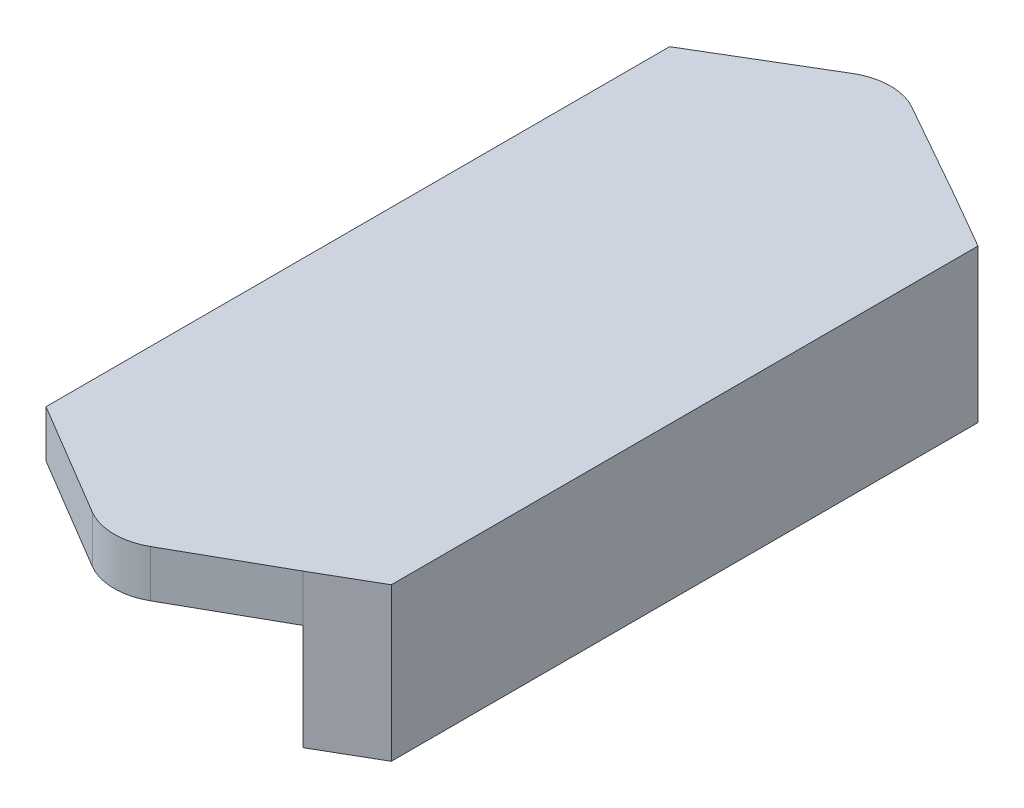
ISO-10303-21;
HEADER;
FILE_DESCRIPTION(('STEP AP214'),'2;1');
FILE_NAME('part.step','',(''),(''),'','','');
FILE_SCHEMA(('AUTOMOTIVE_DESIGN { 1 0 10303 214 1 1 1 1 }'));
ENDSEC;
DATA;
#1=APPLICATION_CONTEXT('core data for automotive mechanical design processes');
#2=APPLICATION_PROTOCOL_DEFINITION('international standard','automotive_design',2000,#1);
#3=PRODUCT_CONTEXT('',#1,'mechanical');
#4=PRODUCT('Part','Part','',(#3));
#5=PRODUCT_RELATED_PRODUCT_CATEGORY('part','',(#4));
#6=PRODUCT_DEFINITION_FORMATION('','',#4);
#7=PRODUCT_DEFINITION_CONTEXT('part definition',#1,'design');
#8=PRODUCT_DEFINITION('design','',#6,#7);
#9=PRODUCT_DEFINITION_SHAPE('','',#8);
#10=(LENGTH_UNIT() NAMED_UNIT(*) SI_UNIT(.MILLI.,.METRE.));
#11=(NAMED_UNIT(*) PLANE_ANGLE_UNIT() SI_UNIT($,.RADIAN.));
#12=(NAMED_UNIT(*) SI_UNIT($,.STERADIAN.) SOLID_ANGLE_UNIT());
#13=UNCERTAINTY_MEASURE_WITH_UNIT(LENGTH_MEASURE(1.E-05),#10,'distance_accuracy_value','');
#14=(GEOMETRIC_REPRESENTATION_CONTEXT(3) GLOBAL_UNCERTAINTY_ASSIGNED_CONTEXT((#13)) GLOBAL_UNIT_ASSIGNED_CONTEXT((#10,
#11,#12)) REPRESENTATION_CONTEXT('',''));
#15=CARTESIAN_POINT('',(0.,0.,0.));
#16=DIRECTION('',(0.,0.,1.));
#17=DIRECTION('',(1.,0.,0.));
#18=AXIS2_PLACEMENT_3D('',#15,#16,#17);
#19=CARTESIAN_POINT('',(30.,9.,-31.));
#20=DIRECTION('',(-1.,0.,0.));
#21=DIRECTION('',(0.,0.,1.));
#22=AXIS2_PLACEMENT_3D('',#19,#20,#21);
#23=PLANE('',#22);
#24=DIRECTION('',(0.,-1.,0.));
#25=VECTOR('',#24,1.);
#26=CARTESIAN_POINT('',(30.,20.,-24.9378221735089));
#27=LINE('',#26,#25);
#28=CARTESIAN_POINT('',(30.,13.,-24.9378221735089));
#29=VERTEX_POINT('',#28);
#30=CARTESIAN_POINT('',(30.,0.,-24.9378221735089));
#31=VERTEX_POINT('',#30);
#32=EDGE_CURVE('E277',#29,#31,#27,.T.);
#33=ORIENTED_EDGE('',*,*,#32,.F.);
#34=DIRECTION('',(0.,0.,-1.));
#35=VECTOR('',#34,1.);
#36=CARTESIAN_POINT('',(30.,13.,0.));
#37=LINE('',#36,#35);
#38=CARTESIAN_POINT('',(30.,13.,24.9378221735089));
#39=VERTEX_POINT('',#38);
#40=EDGE_CURVE('E362',#39,#29,#37,.T.);
#41=ORIENTED_EDGE('',*,*,#40,.F.);
#42=DIRECTION('',(0.,-1.,0.));
#43=VECTOR('',#42,1.);
#44=CARTESIAN_POINT('',(30.,20.,24.9378221735089));
#45=LINE('',#44,#43);
#46=CARTESIAN_POINT('',(30.,0.,24.9378221735089));
#47=VERTEX_POINT('',#46);
#48=EDGE_CURVE('E279',#39,#47,#45,.T.);
#49=ORIENTED_EDGE('',*,*,#48,.T.);
#50=DIRECTION('',(0.,0.,-1.));
#51=VECTOR('',#50,1.);
#52=CARTESIAN_POINT('',(30.,0.,-31.));
#53=LINE('',#52,#51);
#54=EDGE_CURVE('E11',#47,#31,#53,.T.);
#55=ORIENTED_EDGE('',*,*,#54,.T.);
#56=EDGE_LOOP('',(#33,#41,#49,#55));
#57=FACE_BOUND('',#56,.T.);
#58=ADVANCED_FACE('F41',(#57),#23,.F.);
#59=CARTESIAN_POINT('',(0.,0.,0.));
#60=DIRECTION('',(0.,1.,0.));
#61=DIRECTION('',(0.,0.,1.));
#62=AXIS2_PLACEMENT_3D('',#59,#60,#61);
#63=PLANE('',#62);
#64=DIRECTION('',(0.866025403784433,0.,0.50000000000001));
#65=VECTOR('',#64,1.);
#66=CARTESIAN_POINT('',(18.2983937586592,0.,-31.6937476868982));
#67=LINE('',#66,#65);
#68=CARTESIAN_POINT('',(25.2368602791856,0.,-27.687822173509));
#69=VERTEX_POINT('',#68);
#70=EDGE_CURVE('E255',#69,#31,#67,.T.);
#71=ORIENTED_EDGE('',*,*,#70,.T.);
#72=ORIENTED_EDGE('',*,*,#54,.F.);
#73=DIRECTION('',(0.866025403784432,0.,-0.500000000000011));
#74=VECTOR('',#73,1.);
#75=CARTESIAN_POINT('',(18.2983937586593,0.,31.6937476868981));
#76=LINE('',#75,#74);
#77=CARTESIAN_POINT('',(25.2368602791856,0.,27.687822173509));
#78=VERTEX_POINT('',#77);
#79=EDGE_CURVE('E253',#78,#47,#76,.T.);
#80=ORIENTED_EDGE('',*,*,#79,.F.);
#81=DIRECTION('',(-0.5,0.,-0.866025403784439));
#82=VECTOR('',#81,1.);
#83=CARTESIAN_POINT('',(6.93846652052682,0.,-4.00592551338936));
#84=LINE('',#83,#82);
#85=CARTESIAN_POINT('',(23.9061815852943,0.,25.3830190671398));
#86=VERTEX_POINT('',#85);
#87=EDGE_CURVE('E250',#78,#86,#84,.T.);
#88=ORIENTED_EDGE('',*,*,#87,.T.);
#89=DIRECTION('',(0.452584612212934,0.,-0.891721463680262));
#90=VECTOR('',#89,1.);
#91=CARTESIAN_POINT('',(29.2534746589774,0.,14.8473183877084));
#92=LINE('',#91,#90);
#93=CARTESIAN_POINT('',(28.7,0.,15.9378221735089));
#94=VERTEX_POINT('',#93);
#95=EDGE_CURVE('E247',#86,#94,#92,.T.);
#96=ORIENTED_EDGE('',*,*,#95,.T.);
#97=DIRECTION('',(0.236059944158116,0.,0.971738495051044));
#98=VECTOR('',#97,1.);
#99=CARTESIAN_POINT('',(23.4447589918008,0.,-5.69532701090972));
#100=LINE('',#99,#98);
#101=CARTESIAN_POINT('',(25.8,0.,3.99999999999999));
#102=VERTEX_POINT('',#101);
#103=EDGE_CURVE('E244',#102,#94,#100,.T.);
#104=ORIENTED_EDGE('',*,*,#103,.F.);
#105=DIRECTION('',(1.,0.,0.));
#106=VECTOR('',#105,1.);
#107=CARTESIAN_POINT('',(0.,0.,3.99999999999999));
#108=LINE('',#107,#106);
#109=CARTESIAN_POINT('',(6.21525020511965,0.,3.99999999999999));
#110=VERTEX_POINT('',#109);
#111=EDGE_CURVE('E241',#110,#102,#108,.T.);
#112=ORIENTED_EDGE('',*,*,#111,.F.);
#113=DIRECTION('',(0.627390488597361,0.,-0.778704805955097));
#114=VECTOR('',#113,1.);
#115=CARTESIAN_POINT('',(5.72301867589068,0.,4.61094814859268));
#116=LINE('',#115,#114);
#117=CARTESIAN_POINT('',(3.71525020511968,0.,7.10295111301421));
#118=VERTEX_POINT('',#117);
#119=EDGE_CURVE('E238',#118,#110,#116,.T.);
#120=ORIENTED_EDGE('',*,*,#119,.F.);
#121=DIRECTION('',(1.,0.,0.));
#122=VECTOR('',#121,1.);
#123=CARTESIAN_POINT('',(0.,0.,7.10295111301421));
#124=LINE('',#123,#122);
#125=CARTESIAN_POINT('',(2.21525020511971,0.,7.10295111301421));
#126=VERTEX_POINT('',#125);
#127=EDGE_CURVE('E235',#126,#118,#124,.T.);
#128=ORIENTED_EDGE('',*,*,#127,.F.);
#129=DIRECTION('',(0.,0.,1.));
#130=VECTOR('',#129,1.);
#131=CARTESIAN_POINT('',(2.21525020511971,0.,0.));
#132=LINE('',#131,#130);
#133=CARTESIAN_POINT('',(2.21525020511971,0.,-7.10295111301421));
#134=VERTEX_POINT('',#133);
#135=EDGE_CURVE('E232',#134,#126,#132,.T.);
#136=ORIENTED_EDGE('',*,*,#135,.F.);
#137=DIRECTION('',(1.,0.,0.));
#138=VECTOR('',#137,1.);
#139=CARTESIAN_POINT('',(0.,0.,-7.10295111301421));
#140=LINE('',#139,#138);
#141=CARTESIAN_POINT('',(3.71525020511967,0.,-7.10295111301421));
#142=VERTEX_POINT('',#141);
#143=EDGE_CURVE('E229',#134,#142,#140,.T.);
#144=ORIENTED_EDGE('',*,*,#143,.T.);
#145=DIRECTION('',(0.627390488597362,0.,0.778704805955096));
#146=VECTOR('',#145,1.);
#147=CARTESIAN_POINT('',(5.72301867589068,0.,-4.6109481485927));
#148=LINE('',#147,#146);
#149=CARTESIAN_POINT('',(6.21525020511965,0.,-4.));
#150=VERTEX_POINT('',#149);
#151=EDGE_CURVE('E221',#142,#150,#148,.T.);
#152=ORIENTED_EDGE('',*,*,#151,.T.);
#153=DIRECTION('',(1.,0.,0.));
#154=VECTOR('',#153,1.);
#155=CARTESIAN_POINT('',(0.,0.,-3.99999999999999));
#156=LINE('',#155,#154);
#157=CARTESIAN_POINT('',(25.8,0.,-4.00000000000001));
#158=VERTEX_POINT('',#157);
#159=EDGE_CURVE('E55',#150,#158,#156,.T.);
#160=ORIENTED_EDGE('',*,*,#159,.T.);
#161=DIRECTION('',(0.236059944158115,0.,-0.971738495051044));
#162=VECTOR('',#161,1.);
#163=CARTESIAN_POINT('',(23.4447589918008,0.,5.6953270109097));
#164=LINE('',#163,#162);
#165=CARTESIAN_POINT('',(28.7,0.,-15.9378221735089));
#166=VERTEX_POINT('',#165);
#167=EDGE_CURVE('E264',#158,#166,#164,.T.);
#168=ORIENTED_EDGE('',*,*,#167,.T.);
#169=DIRECTION('',(0.452584612212935,0.,0.891721463680261));
#170=VECTOR('',#169,1.);
#171=CARTESIAN_POINT('',(29.2534746589774,0.,-14.8473183877084));
#172=LINE('',#171,#170);
#173=CARTESIAN_POINT('',(23.9061815852943,0.,-25.3830190671398));
#174=VERTEX_POINT('',#173);
#175=EDGE_CURVE('E261',#174,#166,#172,.T.);
#176=ORIENTED_EDGE('',*,*,#175,.F.);
#177=DIRECTION('',(-0.5,0.,0.866025403784439));
#178=VECTOR('',#177,1.);
#179=CARTESIAN_POINT('',(6.9384665205268,0.,4.00592551338935));
#180=LINE('',#179,#178);
#181=EDGE_CURVE('E258',#69,#174,#180,.T.);
#182=ORIENTED_EDGE('',*,*,#181,.F.);
#183=EDGE_LOOP('',(#71,#72,#80,#88,#96,#104,#112,#120,#128,#136,#144,#152,#160,#168,#176,#182));
#184=FACE_BOUND('',#183,.T.);
#185=ADVANCED_FACE('F340',(#184),#63,.F.);
#186=CARTESIAN_POINT('',(0.,20.,-3.99999999999999));
#187=DIRECTION('',(0.,0.,-1.));
#188=DIRECTION('',(-1.,0.,0.));
#189=AXIS2_PLACEMENT_3D('',#186,#187,#188);
#190=PLANE('',#189);
#191=DIRECTION('',(0.,-1.,0.));
#192=VECTOR('',#191,1.);
#193=CARTESIAN_POINT('',(25.8,20.,-4.00000000000001));
#194=LINE('',#193,#192);
#195=CARTESIAN_POINT('',(25.8,9.,-4.00000000000001));
#196=VERTEX_POINT('',#195);
#197=EDGE_CURVE('E268',#196,#158,#194,.T.);
#198=ORIENTED_EDGE('',*,*,#197,.T.);
#199=ORIENTED_EDGE('',*,*,#159,.F.);
#200=DIRECTION('',(0.,-1.,0.));
#201=VECTOR('',#200,1.);
#202=CARTESIAN_POINT('',(6.21525020511965,20.,-4.));
#203=LINE('',#202,#201);
#204=CARTESIAN_POINT('',(6.21525020511965,9.,-4.));
#205=VERTEX_POINT('',#204);
#206=EDGE_CURVE('E267',#205,#150,#203,.T.);
#207=ORIENTED_EDGE('',*,*,#206,.F.);
#208=DIRECTION('',(-1.,0.,0.));
#209=VECTOR('',#208,1.);
#210=CARTESIAN_POINT('',(0.,9.,-3.99999999999999));
#211=LINE('',#210,#209);
#212=EDGE_CURVE('E48',#196,#205,#211,.T.);
#213=ORIENTED_EDGE('',*,*,#212,.F.);
#214=EDGE_LOOP('',(#198,#199,#207,#213));
#215=FACE_BOUND('',#214,.T.);
#216=ADVANCED_FACE('F347',(#215),#190,.T.);
#217=CARTESIAN_POINT('',(23.4447589918008,20.,5.6953270109097));
#218=DIRECTION('',(-0.971738495051044,0.,-0.236059944158115));
#219=DIRECTION('',(-0.236059944158115,0.,0.971738495051044));
#220=AXIS2_PLACEMENT_3D('',#217,#218,#219);
#221=PLANE('',#220);
#222=DIRECTION('',(0.,-1.,0.));
#223=VECTOR('',#222,1.);
#224=CARTESIAN_POINT('',(28.7,20.,-15.9378221735089));
#225=LINE('',#224,#223);
#226=CARTESIAN_POINT('',(28.7,9.,-15.9378221735089));
#227=VERTEX_POINT('',#226);
#228=EDGE_CURVE('E271',#227,#166,#225,.T.);
#229=ORIENTED_EDGE('',*,*,#228,.T.);
#230=ORIENTED_EDGE('',*,*,#167,.F.);
#231=ORIENTED_EDGE('',*,*,#197,.F.);
#232=DIRECTION('',(-0.236059944158115,0.,0.971738495051044));
#233=VECTOR('',#232,1.);
#234=CARTESIAN_POINT('',(23.4447589918008,9.,5.6953270109097));
#235=LINE('',#234,#233);
#236=EDGE_CURVE('E324',#227,#196,#235,.T.);
#237=ORIENTED_EDGE('',*,*,#236,.F.);
#238=EDGE_LOOP('',(#229,#230,#231,#237));
#239=FACE_BOUND('',#238,.T.);
#240=ADVANCED_FACE('F332',(#239),#221,.T.);
#241=CARTESIAN_POINT('',(29.2534746589774,20.,-14.8473183877084));
#242=DIRECTION('',(0.891721463680261,0.,-0.452584612212935));
#243=DIRECTION('',(-0.452584612212935,0.,-0.891721463680261));
#244=AXIS2_PLACEMENT_3D('',#241,#242,#243);
#245=PLANE('',#244);
#246=DIRECTION('',(-0.452584612212935,0.,-0.891721463680261));
#247=VECTOR('',#246,1.);
#248=CARTESIAN_POINT('',(29.2534746589774,9.,-14.8473183877084));
#249=LINE('',#248,#247);
#250=CARTESIAN_POINT('',(23.9061815852943,9.,-25.3830190671398));
#251=VERTEX_POINT('',#250);
#252=EDGE_CURVE('E322',#227,#251,#249,.T.);
#253=ORIENTED_EDGE('',*,*,#252,.T.);
#254=DIRECTION('',(0.,-1.,0.));
#255=VECTOR('',#254,1.);
#256=CARTESIAN_POINT('',(23.9061815852943,20.,-25.3830190671398));
#257=LINE('',#256,#255);
#258=EDGE_CURVE('E273',#251,#174,#257,.T.);
#259=ORIENTED_EDGE('',*,*,#258,.T.);
#260=ORIENTED_EDGE('',*,*,#175,.T.);
#261=ORIENTED_EDGE('',*,*,#228,.F.);
#262=EDGE_LOOP('',(#253,#259,#260,#261));
#263=FACE_BOUND('',#262,.T.);
#264=ADVANCED_FACE('F335',(#263),#245,.F.);
#265=CARTESIAN_POINT('',(6.9384665205268,20.,4.00592551338935));
#266=DIRECTION('',(0.866025403784439,0.,0.5));
#267=DIRECTION('',(0.5,0.,-0.866025403784439));
#268=AXIS2_PLACEMENT_3D('',#265,#266,#267);
#269=PLANE('',#268);
#270=DIRECTION('',(0.5,0.,-0.866025403784439));
#271=VECTOR('',#270,1.);
#272=CARTESIAN_POINT('',(6.9384665205268,9.,4.00592551338935));
#273=LINE('',#272,#271);
#274=CARTESIAN_POINT('',(25.2368602791856,9.,-27.687822173509));
#275=VERTEX_POINT('',#274);
#276=EDGE_CURVE('E320',#251,#275,#273,.T.);
#277=ORIENTED_EDGE('',*,*,#276,.T.);
#278=DIRECTION('',(0.,-1.,0.));
#279=VECTOR('',#278,1.);
#280=CARTESIAN_POINT('',(25.2368602791856,20.,-27.687822173509));
#281=LINE('',#280,#279);
#282=EDGE_CURVE('E275',#275,#69,#281,.T.);
#283=ORIENTED_EDGE('',*,*,#282,.T.);
#284=ORIENTED_EDGE('',*,*,#181,.T.);
#285=ORIENTED_EDGE('',*,*,#258,.F.);
#286=EDGE_LOOP('',(#277,#283,#284,#285));
#287=FACE_BOUND('',#286,.T.);
#288=ADVANCED_FACE('F525',(#287),#269,.F.);
#289=CARTESIAN_POINT('',(18.2983937586592,20.,-31.6937476868982));
#290=DIRECTION('',(0.50000000000001,0.,-0.866025403784433));
#291=DIRECTION('',(-0.866025403784433,0.,-0.50000000000001));
#292=AXIS2_PLACEMENT_3D('',#289,#290,#291);
#293=PLANE('',#292);
#294=ORIENTED_EDGE('',*,*,#32,.T.);
#295=ORIENTED_EDGE('',*,*,#70,.F.);
#296=ORIENTED_EDGE('',*,*,#282,.F.);
#297=DIRECTION('',(0.,-1.,0.));
#298=VECTOR('',#297,1.);
#299=CARTESIAN_POINT('',(25.2368602791856,13.,-27.687822173509));
#300=LINE('',#299,#298);
#301=CARTESIAN_POINT('',(25.2368602791856,13.,-27.687822173509));
#302=VERTEX_POINT('',#301);
#303=EDGE_CURVE('E377',#302,#275,#300,.T.);
#304=ORIENTED_EDGE('',*,*,#303,.F.);
#305=DIRECTION('',(-0.866025403784433,0.,-0.50000000000001));
#306=VECTOR('',#305,1.);
#307=CARTESIAN_POINT('',(18.2983937586592,13.,-31.6937476868982));
#308=LINE('',#307,#306);
#309=EDGE_CURVE('E368',#29,#302,#308,.T.);
#310=ORIENTED_EDGE('',*,*,#309,.F.);
#311=EDGE_LOOP('',(#294,#295,#296,#304,#310));
#312=FACE_BOUND('',#311,.T.);
#313=ADVANCED_FACE('F374',(#312),#293,.T.);
#314=CARTESIAN_POINT('',(18.2983937586593,20.,31.6937476868981));
#315=DIRECTION('',(-0.500000000000011,0.,-0.866025403784432));
#316=DIRECTION('',(-0.866025403784432,0.,0.500000000000011));
#317=AXIS2_PLACEMENT_3D('',#314,#315,#316);
#318=PLANE('',#317);
#319=ORIENTED_EDGE('',*,*,#48,.F.);
#320=DIRECTION('',(0.866025403784432,0.,-0.500000000000011));
#321=VECTOR('',#320,1.);
#322=CARTESIAN_POINT('',(18.2983937586593,13.,31.6937476868981));
#323=LINE('',#322,#321);
#324=CARTESIAN_POINT('',(25.2368602791856,13.,27.6878221735089));
#325=VERTEX_POINT('',#324);
#326=EDGE_CURVE('E372',#325,#39,#323,.T.);
#327=ORIENTED_EDGE('',*,*,#326,.F.);
#328=DIRECTION('',(0.,-1.,0.));
#329=VECTOR('',#328,1.);
#330=CARTESIAN_POINT('',(25.2368602791856,13.,27.6878221735089));
#331=LINE('',#330,#329);
#332=CARTESIAN_POINT('',(25.2368602791856,9.,27.6878221735089));
#333=VERTEX_POINT('',#332);
#334=EDGE_CURVE('E413',#325,#333,#331,.T.);
#335=ORIENTED_EDGE('',*,*,#334,.T.);
#336=DIRECTION('',(0.,-1.,0.));
#337=VECTOR('',#336,1.);
#338=CARTESIAN_POINT('',(25.2368602791856,20.,27.687822173509));
#339=LINE('',#338,#337);
#340=EDGE_CURVE('E282',#333,#78,#339,.T.);
#341=ORIENTED_EDGE('',*,*,#340,.T.);
#342=ORIENTED_EDGE('',*,*,#79,.T.);
#343=EDGE_LOOP('',(#319,#327,#335,#341,#342));
#344=FACE_BOUND('',#343,.T.);
#345=ADVANCED_FACE('F430',(#344),#318,.F.);
#346=CARTESIAN_POINT('',(6.93846652052682,20.,-4.00592551338936));
#347=DIRECTION('',(-0.866025403784439,0.,0.5));
#348=DIRECTION('',(0.5,0.,0.866025403784439));
#349=AXIS2_PLACEMENT_3D('',#346,#347,#348);
#350=PLANE('',#349);
#351=DIRECTION('',(0.,-1.,0.));
#352=VECTOR('',#351,1.);
#353=CARTESIAN_POINT('',(23.9061815852943,20.,25.3830190671398));
#354=LINE('',#353,#352);
#355=CARTESIAN_POINT('',(23.9061815852943,9.,25.3830190671398));
#356=VERTEX_POINT('',#355);
#357=EDGE_CURVE('E284',#356,#86,#354,.T.);
#358=ORIENTED_EDGE('',*,*,#357,.T.);
#359=ORIENTED_EDGE('',*,*,#87,.F.);
#360=ORIENTED_EDGE('',*,*,#340,.F.);
#361=DIRECTION('',(0.5,0.,0.866025403784439));
#362=VECTOR('',#361,1.);
#363=CARTESIAN_POINT('',(6.93846652052682,9.,-4.00592551338936));
#364=LINE('',#363,#362);
#365=EDGE_CURVE('E317',#356,#333,#364,.T.);
#366=ORIENTED_EDGE('',*,*,#365,.F.);
#367=EDGE_LOOP('',(#358,#359,#360,#366));
#368=FACE_BOUND('',#367,.T.);
#369=ADVANCED_FACE('F472',(#368),#350,.T.);
#370=CARTESIAN_POINT('',(29.2534746589774,20.,14.8473183877084));
#371=DIRECTION('',(-0.891721463680262,0.,-0.452584612212934));
#372=DIRECTION('',(-0.452584612212934,0.,0.891721463680262));
#373=AXIS2_PLACEMENT_3D('',#370,#371,#372);
#374=PLANE('',#373);
#375=DIRECTION('',(0.,-1.,0.));
#376=VECTOR('',#375,1.);
#377=CARTESIAN_POINT('',(28.7,20.,15.9378221735089));
#378=LINE('',#377,#376);
#379=CARTESIAN_POINT('',(28.7,9.,15.9378221735089));
#380=VERTEX_POINT('',#379);
#381=EDGE_CURVE('E286',#380,#94,#378,.T.);
#382=ORIENTED_EDGE('',*,*,#381,.T.);
#383=ORIENTED_EDGE('',*,*,#95,.F.);
#384=ORIENTED_EDGE('',*,*,#357,.F.);
#385=DIRECTION('',(-0.452584612212934,0.,0.891721463680262));
#386=VECTOR('',#385,1.);
#387=CARTESIAN_POINT('',(29.2534746589774,9.,14.8473183877084));
#388=LINE('',#387,#386);
#389=EDGE_CURVE('E314',#380,#356,#388,.T.);
#390=ORIENTED_EDGE('',*,*,#389,.F.);
#391=EDGE_LOOP('',(#382,#383,#384,#390));
#392=FACE_BOUND('',#391,.T.);
#393=ADVANCED_FACE('F471',(#392),#374,.T.);
#394=CARTESIAN_POINT('',(23.4447589918008,20.,-5.69532701090972));
#395=DIRECTION('',(0.971738495051044,0.,-0.236059944158116));
#396=DIRECTION('',(-0.236059944158116,0.,-0.971738495051044));
#397=AXIS2_PLACEMENT_3D('',#394,#395,#396);
#398=PLANE('',#397);
#399=DIRECTION('',(-0.236059944158116,0.,-0.971738495051044));
#400=VECTOR('',#399,1.);
#401=CARTESIAN_POINT('',(23.4447589918008,9.,-5.69532701090972));
#402=LINE('',#401,#400);
#403=CARTESIAN_POINT('',(25.8,9.,3.99999999999999));
#404=VERTEX_POINT('',#403);
#405=EDGE_CURVE('E312',#380,#404,#402,.T.);
#406=ORIENTED_EDGE('',*,*,#405,.T.);
#407=DIRECTION('',(0.,-1.,0.));
#408=VECTOR('',#407,1.);
#409=CARTESIAN_POINT('',(25.8,20.,3.99999999999999));
#410=LINE('',#409,#408);
#411=EDGE_CURVE('E288',#404,#102,#410,.T.);
#412=ORIENTED_EDGE('',*,*,#411,.T.);
#413=ORIENTED_EDGE('',*,*,#103,.T.);
#414=ORIENTED_EDGE('',*,*,#381,.F.);
#415=EDGE_LOOP('',(#406,#412,#413,#414));
#416=FACE_BOUND('',#415,.T.);
#417=ADVANCED_FACE('F467',(#416),#398,.F.);
#418=CARTESIAN_POINT('',(0.,20.,3.99999999999999));
#419=DIRECTION('',(0.,0.,-1.));
#420=DIRECTION('',(-1.,0.,0.));
#421=AXIS2_PLACEMENT_3D('',#418,#419,#420);
#422=PLANE('',#421);
#423=DIRECTION('',(-1.,0.,0.));
#424=VECTOR('',#423,1.);
#425=CARTESIAN_POINT('',(0.,9.,3.99999999999999));
#426=LINE('',#425,#424);
#427=CARTESIAN_POINT('',(6.21525020511965,9.,3.99999999999999));
#428=VERTEX_POINT('',#427);
#429=EDGE_CURVE('E310',#404,#428,#426,.T.);
#430=ORIENTED_EDGE('',*,*,#429,.T.);
#431=DIRECTION('',(0.,-1.,0.));
#432=VECTOR('',#431,1.);
#433=CARTESIAN_POINT('',(6.21525020511965,20.,3.99999999999999));
#434=LINE('',#433,#432);
#435=EDGE_CURVE('E290',#428,#110,#434,.T.);
#436=ORIENTED_EDGE('',*,*,#435,.T.);
#437=ORIENTED_EDGE('',*,*,#111,.T.);
#438=ORIENTED_EDGE('',*,*,#411,.F.);
#439=EDGE_LOOP('',(#430,#436,#437,#438));
#440=FACE_BOUND('',#439,.T.);
#441=ADVANCED_FACE('F463',(#440),#422,.F.);
#442=CARTESIAN_POINT('',(5.72301867589068,20.,4.61094814859268));
#443=DIRECTION('',(-0.778704805955097,0.,-0.627390488597361));
#444=DIRECTION('',(-0.627390488597361,0.,0.778704805955097));
#445=AXIS2_PLACEMENT_3D('',#442,#443,#444);
#446=PLANE('',#445);
#447=DIRECTION('',(-0.627390488597361,0.,0.778704805955097));
#448=VECTOR('',#447,1.);
#449=CARTESIAN_POINT('',(5.72301867589068,9.,4.61094814859269));
#450=LINE('',#449,#448);
#451=CARTESIAN_POINT('',(3.71525020511968,9.,7.10295111301421));
#452=VERTEX_POINT('',#451);
#453=EDGE_CURVE('E308',#428,#452,#450,.T.);
#454=ORIENTED_EDGE('',*,*,#453,.T.);
#455=DIRECTION('',(0.,-1.,0.));
#456=VECTOR('',#455,1.);
#457=CARTESIAN_POINT('',(3.71525020511968,20.,7.10295111301421));
#458=LINE('',#457,#456);
#459=EDGE_CURVE('E292',#452,#118,#458,.T.);
#460=ORIENTED_EDGE('',*,*,#459,.T.);
#461=ORIENTED_EDGE('',*,*,#119,.T.);
#462=ORIENTED_EDGE('',*,*,#435,.F.);
#463=EDGE_LOOP('',(#454,#460,#461,#462));
#464=FACE_BOUND('',#463,.T.);
#465=ADVANCED_FACE('F461',(#464),#446,.F.);
#466=CARTESIAN_POINT('',(0.,20.,7.10295111301421));
#467=DIRECTION('',(0.,0.,-1.));
#468=DIRECTION('',(-1.,0.,0.));
#469=AXIS2_PLACEMENT_3D('',#466,#467,#468);
#470=PLANE('',#469);
#471=DIRECTION('',(-1.,0.,0.));
#472=VECTOR('',#471,1.);
#473=CARTESIAN_POINT('',(0.,9.,7.10295111301421));
#474=LINE('',#473,#472);
#475=CARTESIAN_POINT('',(2.21525020511971,9.,7.10295111301421));
#476=VERTEX_POINT('',#475);
#477=EDGE_CURVE('E306',#452,#476,#474,.T.);
#478=ORIENTED_EDGE('',*,*,#477,.T.);
#479=DIRECTION('',(0.,-1.,0.));
#480=VECTOR('',#479,1.);
#481=CARTESIAN_POINT('',(2.21525020511971,20.,7.10295111301421));
#482=LINE('',#481,#480);
#483=EDGE_CURVE('E294',#476,#126,#482,.T.);
#484=ORIENTED_EDGE('',*,*,#483,.T.);
#485=ORIENTED_EDGE('',*,*,#127,.T.);
#486=ORIENTED_EDGE('',*,*,#459,.F.);
#487=EDGE_LOOP('',(#478,#484,#485,#486));
#488=FACE_BOUND('',#487,.T.);
#489=ADVANCED_FACE('F456',(#488),#470,.F.);
#490=CARTESIAN_POINT('',(2.21525020511971,20.,0.));
#491=DIRECTION('',(1.,0.,0.));
#492=DIRECTION('',(0.,0.,-1.));
#493=AXIS2_PLACEMENT_3D('',#490,#491,#492);
#494=PLANE('',#493);
#495=ORIENTED_EDGE('',*,*,#483,.F.);
#496=DIRECTION('',(0.,0.,1.));
#497=VECTOR('',#496,1.);
#498=CARTESIAN_POINT('',(2.21525020511971,9.,0.));
#499=LINE('',#498,#497);
#500=CARTESIAN_POINT('',(2.21525020511973,9.,26.5054726103521));
#501=VERTEX_POINT('',#500);
#502=EDGE_CURVE('E218',#476,#501,#499,.T.);
#503=ORIENTED_EDGE('',*,*,#502,.T.);
#504=DIRECTION('',(0.,-1.,0.));
#505=VECTOR('',#504,1.);
#506=CARTESIAN_POINT('',(2.21525020511973,13.,26.5054726103521));
#507=LINE('',#506,#505);
#508=CARTESIAN_POINT('',(2.21525020511973,13.,26.5054726103521));
#509=VERTEX_POINT('',#508);
#510=EDGE_CURVE('E199',#509,#501,#507,.T.);
#511=ORIENTED_EDGE('',*,*,#510,.F.);
#512=DIRECTION('',(0.,0.,1.));
#513=VECTOR('',#512,1.);
#514=CARTESIAN_POINT('',(2.21525020511971,13.,0.));
#515=LINE('',#514,#513);
#516=CARTESIAN_POINT('',(2.21525020511971,13.,-26.5054726103521));
#517=VERTEX_POINT('',#516);
#518=EDGE_CURVE('E205',#517,#509,#515,.T.);
#519=ORIENTED_EDGE('',*,*,#518,.F.);
#520=DIRECTION('',(0.,-1.,0.));
#521=VECTOR('',#520,1.);
#522=CARTESIAN_POINT('',(2.21525020511971,13.,-26.5054726103521));
#523=LINE('',#522,#521);
#524=CARTESIAN_POINT('',(2.21525020511971,9.,-26.5054726103521));
#525=VERTEX_POINT('',#524);
#526=EDGE_CURVE('E387',#517,#525,#523,.T.);
#527=ORIENTED_EDGE('',*,*,#526,.T.);
#528=CARTESIAN_POINT('',(2.21525020511971,9.,-7.10295111301421));
#529=VERTEX_POINT('',#528);
#530=EDGE_CURVE('E388',#525,#529,#499,.T.);
#531=ORIENTED_EDGE('',*,*,#530,.T.);
#532=DIRECTION('',(0.,-1.,0.));
#533=VECTOR('',#532,1.);
#534=CARTESIAN_POINT('',(2.21525020511971,20.,-7.10295111301421));
#535=LINE('',#534,#533);
#536=EDGE_CURVE('E296',#529,#134,#535,.T.);
#537=ORIENTED_EDGE('',*,*,#536,.T.);
#538=ORIENTED_EDGE('',*,*,#135,.T.);
#539=EDGE_LOOP('',(#495,#503,#511,#519,#527,#531,#537,#538));
#540=FACE_BOUND('',#539,.T.);
#541=ADVANCED_FACE('F216',(#540),#494,.F.);
#542=CARTESIAN_POINT('',(0.,20.,-7.10295111301421));
#543=DIRECTION('',(0.,0.,-1.));
#544=DIRECTION('',(-1.,0.,0.));
#545=AXIS2_PLACEMENT_3D('',#542,#543,#544);
#546=PLANE('',#545);
#547=DIRECTION('',(0.,-1.,0.));
#548=VECTOR('',#547,1.);
#549=CARTESIAN_POINT('',(3.71525020511967,20.,-7.10295111301421));
#550=LINE('',#549,#548);
#551=CARTESIAN_POINT('',(3.71525020511967,9.,-7.10295111301421));
#552=VERTEX_POINT('',#551);
#553=EDGE_CURVE('E298',#552,#142,#550,.T.);
#554=ORIENTED_EDGE('',*,*,#553,.T.);
#555=ORIENTED_EDGE('',*,*,#143,.F.);
#556=ORIENTED_EDGE('',*,*,#536,.F.);
#557=DIRECTION('',(-1.,0.,0.));
#558=VECTOR('',#557,1.);
#559=CARTESIAN_POINT('',(0.,9.,-7.10295111301421));
#560=LINE('',#559,#558);
#561=EDGE_CURVE('E303',#552,#529,#560,.T.);
#562=ORIENTED_EDGE('',*,*,#561,.F.);
#563=EDGE_LOOP('',(#554,#555,#556,#562));
#564=FACE_BOUND('',#563,.T.);
#565=ADVANCED_FACE('F450',(#564),#546,.T.);
#566=CARTESIAN_POINT('',(5.72301867589068,20.,-4.6109481485927));
#567=DIRECTION('',(0.778704805955096,0.,-0.627390488597362));
#568=DIRECTION('',(-0.627390488597362,0.,-0.778704805955096));
#569=AXIS2_PLACEMENT_3D('',#566,#567,#568);
#570=PLANE('',#569);
#571=ORIENTED_EDGE('',*,*,#206,.T.);
#572=ORIENTED_EDGE('',*,*,#151,.F.);
#573=ORIENTED_EDGE('',*,*,#553,.F.);
#574=DIRECTION('',(-0.627390488597362,0.,-0.778704805955096));
#575=VECTOR('',#574,1.);
#576=CARTESIAN_POINT('',(5.72301867589068,9.,-4.6109481485927));
#577=LINE('',#576,#575);
#578=EDGE_CURVE('E270',#205,#552,#577,.T.);
#579=ORIENTED_EDGE('',*,*,#578,.F.);
#580=EDGE_LOOP('',(#571,#572,#573,#579));
#581=FACE_BOUND('',#580,.T.);
#582=ADVANCED_FACE('F346',(#581),#570,.T.);
#583=CARTESIAN_POINT('',(0.,9.,0.));
#584=DIRECTION('',(0.,1.,0.));
#585=DIRECTION('',(0.,0.,1.));
#586=AXIS2_PLACEMENT_3D('',#583,#584,#585);
#587=PLANE('',#586);
#588=ORIENTED_EDGE('',*,*,#276,.F.);
#589=ORIENTED_EDGE('',*,*,#252,.F.);
#590=ORIENTED_EDGE('',*,*,#236,.T.);
#591=ORIENTED_EDGE('',*,*,#212,.T.);
#592=ORIENTED_EDGE('',*,*,#578,.T.);
#593=ORIENTED_EDGE('',*,*,#561,.T.);
#594=ORIENTED_EDGE('',*,*,#530,.F.);
#595=DIRECTION('',(0.859257391199925,0.,-0.511543483653442));
#596=VECTOR('',#595,1.);
#597=CARTESIAN_POINT('',(-11.0707352900483,9.,-18.5958993281526));
#598=LINE('',#597,#596);
#599=CARTESIAN_POINT('',(11.9422825817454,9.,-32.2962869559767));
#600=VERTEX_POINT('',#599);
#601=EDGE_CURVE('E213',#525,#600,#598,.T.);
#602=ORIENTED_EDGE('',*,*,#601,.T.);
#603=CARTESIAN_POINT('',(14.5000000000104,9.,-27.9999999999809));
#604=DIRECTION('',(0.,1.,0.));
#605=DIRECTION('',(0.,0.,1.));
#606=AXIS2_PLACEMENT_3D('',#603,#604,#605);
#607=CIRCLE('',#606,4.99999999999128);
#608=CARTESIAN_POINT('',(16.9550725315601,9.,-32.355756979518));
#609=VERTEX_POINT('',#608);
#610=EDGE_CURVE('E401',#609,#600,#607,.T.);
#611=ORIENTED_EDGE('',*,*,#610,.F.);
#612=DIRECTION('',(-0.87115139590819,0.,-0.491014506310365));
#613=VECTOR('',#612,1.);
#614=CARTESIAN_POINT('',(17.9278968222872,9.,-31.8074357105889));
#615=LINE('',#614,#613);
#616=EDGE_CURVE('E399',#275,#609,#615,.T.);
#617=ORIENTED_EDGE('',*,*,#616,.F.);
#618=EDGE_LOOP('',(#588,#589,#590,#591,#592,#593,#594,#602,#611,#617));
#619=FACE_BOUND('',#618,.T.);
#620=ADVANCED_FACE('F328',(#619),#587,.F.);
#621=CARTESIAN_POINT('',(-11.0707352900483,13.,18.5958993281526));
#622=DIRECTION('',(0.511543483653443,0.,-0.859257391199924));
#623=DIRECTION('',(-0.859257391199924,0.,-0.511543483653443));
#624=AXIS2_PLACEMENT_3D('',#621,#622,#623);
#625=PLANE('',#624);
#626=DIRECTION('',(0.859257391199924,0.,0.511543483653443));
#627=VECTOR('',#626,1.);
#628=CARTESIAN_POINT('',(-11.0707352900483,9.,18.5958993281526));
#629=LINE('',#628,#627);
#630=CARTESIAN_POINT('',(11.9422825817454,9.,32.2962869559767));
#631=VERTEX_POINT('',#630);
#632=EDGE_CURVE('E391',#501,#631,#629,.T.);
#633=ORIENTED_EDGE('',*,*,#632,.T.);
#634=DIRECTION('',(0.,-1.,0.));
#635=VECTOR('',#634,1.);
#636=CARTESIAN_POINT('',(11.9422825817454,13.,32.2962869559767));
#637=LINE('',#636,#635);
#638=CARTESIAN_POINT('',(11.9422825817454,13.,32.2962869559767));
#639=VERTEX_POINT('',#638);
#640=EDGE_CURVE('E200',#639,#631,#637,.T.);
#641=ORIENTED_EDGE('',*,*,#640,.F.);
#642=DIRECTION('',(0.859257391199924,0.,0.511543483653443));
#643=VECTOR('',#642,1.);
#644=CARTESIAN_POINT('',(-11.0707352900483,13.,18.5958993281526));
#645=LINE('',#644,#643);
#646=EDGE_CURVE('E194',#509,#639,#645,.T.);
#647=ORIENTED_EDGE('',*,*,#646,.F.);
#648=ORIENTED_EDGE('',*,*,#510,.T.);
#649=EDGE_LOOP('',(#633,#641,#647,#648));
#650=FACE_BOUND('',#649,.T.);
#651=ADVANCED_FACE('F197',(#650),#625,.F.);
#652=CARTESIAN_POINT('',(14.5000000000104,13.,27.9999999999809));
#653=DIRECTION('',(0.,-1.,0.));
#654=DIRECTION('',(0.,0.,-1.));
#655=AXIS2_PLACEMENT_3D('',#652,#653,#654);
#656=CYLINDRICAL_SURFACE('',#655,4.99999999999129);
#657=CARTESIAN_POINT('',(14.5000000000104,9.,27.9999999999809));
#658=DIRECTION('',(0.,1.,0.));
#659=DIRECTION('',(0.,0.,1.));
#660=AXIS2_PLACEMENT_3D('',#657,#658,#659);
#661=CIRCLE('',#660,4.99999999999129);
#662=CARTESIAN_POINT('',(16.9550725315601,9.,32.355756979518));
#663=VERTEX_POINT('',#662);
#664=EDGE_CURVE('E393',#663,#631,#661,.F.);
#665=ORIENTED_EDGE('',*,*,#664,.F.);
#666=DIRECTION('',(0.,-1.,0.));
#667=VECTOR('',#666,1.);
#668=CARTESIAN_POINT('',(16.9550725315601,13.,32.355756979518));
#669=LINE('',#668,#667);
#670=CARTESIAN_POINT('',(16.9550725315601,13.,32.355756979518));
#671=VERTEX_POINT('',#670);
#672=EDGE_CURVE('E223',#671,#663,#669,.T.);
#673=ORIENTED_EDGE('',*,*,#672,.F.);
#674=CARTESIAN_POINT('',(14.5000000000104,13.,27.9999999999809));
#675=DIRECTION('',(0.,1.,0.));
#676=DIRECTION('',(0.,0.,1.));
#677=AXIS2_PLACEMENT_3D('',#674,#675,#676);
#678=CIRCLE('',#677,4.99999999999129);
#679=EDGE_CURVE('E204',#671,#639,#678,.F.);
#680=ORIENTED_EDGE('',*,*,#679,.T.);
#681=ORIENTED_EDGE('',*,*,#640,.T.);
#682=EDGE_LOOP('',(#665,#673,#680,#681));
#683=FACE_BOUND('',#682,.T.);
#684=ADVANCED_FACE('F422',(#683),#656,.T.);
#685=CARTESIAN_POINT('',(17.9278968222872,13.,31.8074357105889));
#686=DIRECTION('',(0.491014506310365,0.,0.87115139590819));
#687=DIRECTION('',(0.87115139590819,0.,-0.491014506310365));
#688=AXIS2_PLACEMENT_3D('',#685,#686,#687);
#689=PLANE('',#688);
#690=DIRECTION('',(-0.87115139590819,0.,0.491014506310365));
#691=VECTOR('',#690,1.);
#692=CARTESIAN_POINT('',(17.9278968222872,9.,31.8074357105889));
#693=LINE('',#692,#691);
#694=EDGE_CURVE('E396',#333,#663,#693,.T.);
#695=ORIENTED_EDGE('',*,*,#694,.F.);
#696=ORIENTED_EDGE('',*,*,#334,.F.);
#697=DIRECTION('',(-0.87115139590819,0.,0.491014506310365));
#698=VECTOR('',#697,1.);
#699=CARTESIAN_POINT('',(17.9278968222872,13.,31.8074357105889));
#700=LINE('',#699,#698);
#701=EDGE_CURVE('E420',#325,#671,#700,.T.);
#702=ORIENTED_EDGE('',*,*,#701,.T.);
#703=ORIENTED_EDGE('',*,*,#672,.T.);
#704=EDGE_LOOP('',(#695,#696,#702,#703));
#705=FACE_BOUND('',#704,.T.);
#706=ADVANCED_FACE('F419',(#705),#689,.T.);
#707=CARTESIAN_POINT('',(17.9278968222872,13.,-31.8074357105889));
#708=DIRECTION('',(-0.491014506310365,0.,0.87115139590819));
#709=DIRECTION('',(0.87115139590819,0.,0.491014506310365));
#710=AXIS2_PLACEMENT_3D('',#707,#708,#709);
#711=PLANE('',#710);
#712=ORIENTED_EDGE('',*,*,#616,.T.);
#713=DIRECTION('',(0.,-1.,0.));
#714=VECTOR('',#713,1.);
#715=CARTESIAN_POINT('',(16.9550725315601,13.,-32.355756979518));
#716=LINE('',#715,#714);
#717=CARTESIAN_POINT('',(16.9550725315601,13.,-32.355756979518));
#718=VERTEX_POINT('',#717);
#719=EDGE_CURVE('E409',#718,#609,#716,.T.);
#720=ORIENTED_EDGE('',*,*,#719,.F.);
#721=DIRECTION('',(-0.87115139590819,0.,-0.491014506310365));
#722=VECTOR('',#721,1.);
#723=CARTESIAN_POINT('',(17.9278968222872,13.,-31.8074357105889));
#724=LINE('',#723,#722);
#725=EDGE_CURVE('E379',#302,#718,#724,.T.);
#726=ORIENTED_EDGE('',*,*,#725,.F.);
#727=ORIENTED_EDGE('',*,*,#303,.T.);
#728=EDGE_LOOP('',(#712,#720,#726,#727));
#729=FACE_BOUND('',#728,.T.);
#730=ADVANCED_FACE('F438',(#729),#711,.F.);
#731=CARTESIAN_POINT('',(14.5000000000104,13.,-27.9999999999809));
#732=DIRECTION('',(0.,-1.,0.));
#733=DIRECTION('',(0.,0.,-1.));
#734=AXIS2_PLACEMENT_3D('',#731,#732,#733);
#735=CYLINDRICAL_SURFACE('',#734,4.99999999999128);
#736=ORIENTED_EDGE('',*,*,#610,.T.);
#737=DIRECTION('',(0.,-1.,0.));
#738=VECTOR('',#737,1.);
#739=CARTESIAN_POINT('',(11.9422825817454,13.,-32.2962869559767));
#740=LINE('',#739,#738);
#741=CARTESIAN_POINT('',(11.9422825817454,13.,-32.2962869559767));
#742=VERTEX_POINT('',#741);
#743=EDGE_CURVE('E407',#742,#600,#740,.T.);
#744=ORIENTED_EDGE('',*,*,#743,.F.);
#745=CARTESIAN_POINT('',(14.5000000000104,13.,-27.9999999999809));
#746=DIRECTION('',(0.,1.,0.));
#747=DIRECTION('',(0.,0.,1.));
#748=AXIS2_PLACEMENT_3D('',#745,#746,#747);
#749=CIRCLE('',#748,4.99999999999128);
#750=EDGE_CURVE('E381',#718,#742,#749,.T.);
#751=ORIENTED_EDGE('',*,*,#750,.F.);
#752=ORIENTED_EDGE('',*,*,#719,.T.);
#753=EDGE_LOOP('',(#736,#744,#751,#752));
#754=FACE_BOUND('',#753,.T.);
#755=ADVANCED_FACE('F445',(#754),#735,.T.);
#756=CARTESIAN_POINT('',(-11.0707352900483,13.,-18.5958993281526));
#757=DIRECTION('',(-0.511543483653442,0.,-0.859257391199925));
#758=DIRECTION('',(-0.859257391199925,0.,0.511543483653442));
#759=AXIS2_PLACEMENT_3D('',#756,#757,#758);
#760=PLANE('',#759);
#761=ORIENTED_EDGE('',*,*,#601,.F.);
#762=ORIENTED_EDGE('',*,*,#526,.F.);
#763=DIRECTION('',(0.859257391199925,0.,-0.511543483653442));
#764=VECTOR('',#763,1.);
#765=CARTESIAN_POINT('',(-11.0707352900483,13.,-18.5958993281526));
#766=LINE('',#765,#764);
#767=EDGE_CURVE('E211',#517,#742,#766,.T.);
#768=ORIENTED_EDGE('',*,*,#767,.T.);
#769=ORIENTED_EDGE('',*,*,#743,.T.);
#770=EDGE_LOOP('',(#761,#762,#768,#769));
#771=FACE_BOUND('',#770,.T.);
#772=ADVANCED_FACE('F448',(#771),#760,.T.);
#773=CARTESIAN_POINT('',(0.,13.,0.));
#774=DIRECTION('',(0.,1.,0.));
#775=DIRECTION('',(0.,0.,1.));
#776=AXIS2_PLACEMENT_3D('',#773,#774,#775);
#777=PLANE('',#776);
#778=ORIENTED_EDGE('',*,*,#518,.T.);
#779=ORIENTED_EDGE('',*,*,#646,.T.);
#780=ORIENTED_EDGE('',*,*,#679,.F.);
#781=ORIENTED_EDGE('',*,*,#701,.F.);
#782=ORIENTED_EDGE('',*,*,#326,.T.);
#783=ORIENTED_EDGE('',*,*,#40,.T.);
#784=ORIENTED_EDGE('',*,*,#309,.T.);
#785=ORIENTED_EDGE('',*,*,#725,.T.);
#786=ORIENTED_EDGE('',*,*,#750,.T.);
#787=ORIENTED_EDGE('',*,*,#767,.F.);
#788=EDGE_LOOP('',(#778,#779,#780,#781,#782,#783,#784,#785,#786,#787));
#789=FACE_BOUND('',#788,.T.);
#790=ADVANCED_FACE('F209',(#789),#777,.T.);
#791=ORIENTED_EDGE('',*,*,#477,.F.);
#792=ORIENTED_EDGE('',*,*,#453,.F.);
#793=ORIENTED_EDGE('',*,*,#429,.F.);
#794=ORIENTED_EDGE('',*,*,#405,.F.);
#795=ORIENTED_EDGE('',*,*,#389,.T.);
#796=ORIENTED_EDGE('',*,*,#365,.T.);
#797=ORIENTED_EDGE('',*,*,#694,.T.);
#798=ORIENTED_EDGE('',*,*,#664,.T.);
#799=ORIENTED_EDGE('',*,*,#632,.F.);
#800=ORIENTED_EDGE('',*,*,#502,.F.);
#801=EDGE_LOOP('',(#791,#792,#793,#794,#795,#796,#797,#798,#799,#800));
#802=FACE_BOUND('',#801,.T.);
#803=ADVANCED_FACE('F425',(#802),#587,.F.);
#804=CLOSED_SHELL('',(#58,#185,#216,#240,#264,#288,#313,#345,#369,#393,#417,#441,#465,#489,#541,
#565,#582,#620,#651,#684,#706,#730,#755,#772,#790,#803));
#805=MANIFOLD_SOLID_BREP('B2',#804);
#806=ADVANCED_BREP_SHAPE_REPRESENTATION('',(#18,#805),#14);
#807=SHAPE_DEFINITION_REPRESENTATION(#9,#806);
ENDSEC;
END-ISO-10303-21;
